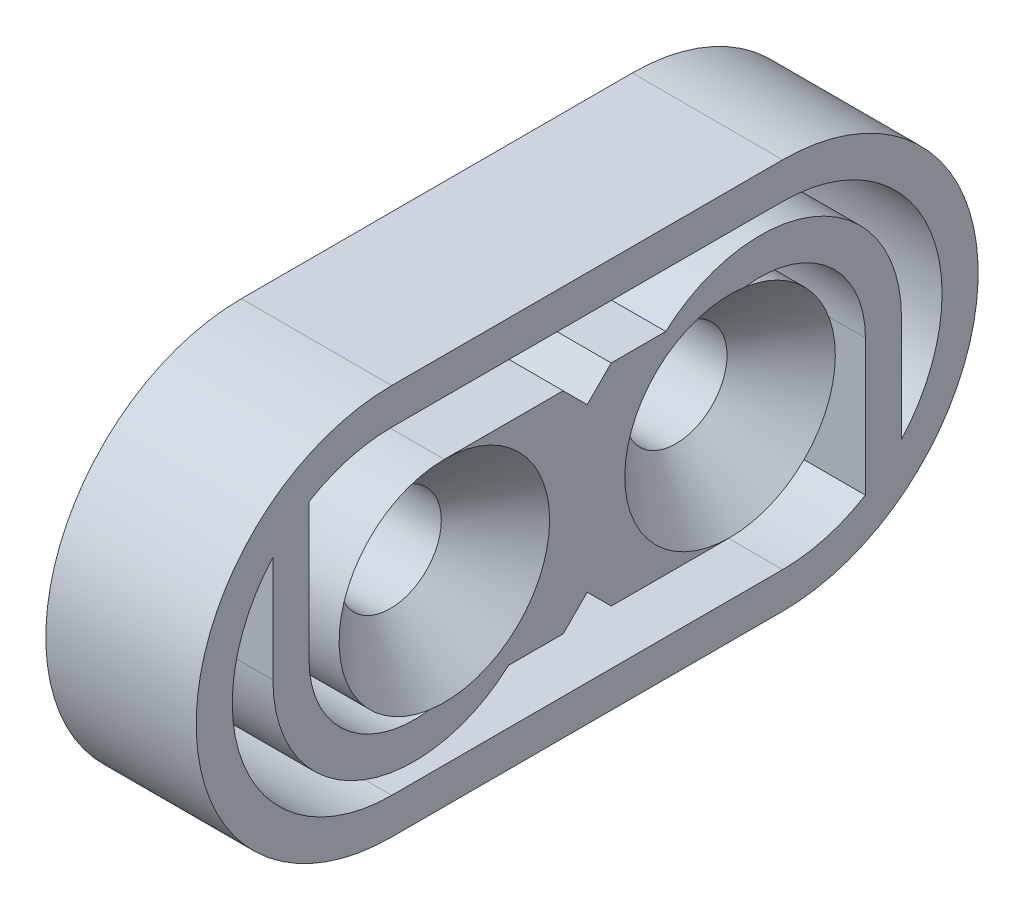
ISO-10303-21;
HEADER;
FILE_DESCRIPTION(('STEP AP214'),'2;1');
FILE_NAME('part.step','',(''),(''),'','','');
FILE_SCHEMA(('AUTOMOTIVE_DESIGN { 1 0 10303 214 1 1 1 1 }'));
ENDSEC;
DATA;
#1=APPLICATION_CONTEXT('core data for automotive mechanical design processes');
#2=APPLICATION_PROTOCOL_DEFINITION('international standard','automotive_design',2000,#1);
#3=PRODUCT_CONTEXT('',#1,'mechanical');
#4=PRODUCT('Part','Part','',(#3));
#5=PRODUCT_RELATED_PRODUCT_CATEGORY('part','',(#4));
#6=PRODUCT_DEFINITION_FORMATION('','',#4);
#7=PRODUCT_DEFINITION_CONTEXT('part definition',#1,'design');
#8=PRODUCT_DEFINITION('design','',#6,#7);
#9=PRODUCT_DEFINITION_SHAPE('','',#8);
#10=(LENGTH_UNIT() NAMED_UNIT(*) SI_UNIT(.MILLI.,.METRE.));
#11=(NAMED_UNIT(*) PLANE_ANGLE_UNIT() SI_UNIT($,.RADIAN.));
#12=(NAMED_UNIT(*) SI_UNIT($,.STERADIAN.) SOLID_ANGLE_UNIT());
#13=UNCERTAINTY_MEASURE_WITH_UNIT(LENGTH_MEASURE(1.E-05),#10,'distance_accuracy_value','');
#14=(GEOMETRIC_REPRESENTATION_CONTEXT(3) GLOBAL_UNCERTAINTY_ASSIGNED_CONTEXT((#13)) GLOBAL_UNIT_ASSIGNED_CONTEXT((#10,
#11,#12)) REPRESENTATION_CONTEXT('',''));
#15=CARTESIAN_POINT('',(0.,0.,0.));
#16=DIRECTION('',(0.,0.,1.));
#17=DIRECTION('',(1.,0.,0.));
#18=AXIS2_PLACEMENT_3D('',#15,#16,#17);
#19=CARTESIAN_POINT('',(5.,0.0278549064895704,6.49624326478912));
#20=DIRECTION('',(1.,0.,0.));
#21=DIRECTION('',(0.,0.,-1.));
#22=AXIS2_PLACEMENT_3D('',#19,#20,#21);
#23=PLANE('',#22);
#24=CARTESIAN_POINT('',(5.,0.0278549064895704,6.49624326478912));
#25=DIRECTION('',(1.,0.,0.));
#26=DIRECTION('',(0.,0.,-1.));
#27=AXIS2_PLACEMENT_3D('',#24,#25,#26);
#28=CIRCLE('',#27,6.5);
#29=CARTESIAN_POINT('',(5.,6.52785490648957,6.49624326478912));
#30=VERTEX_POINT('',#29);
#31=CARTESIAN_POINT('',(5.,-6.47214509351043,6.49624326478912));
#32=VERTEX_POINT('',#31);
#33=EDGE_CURVE('E415',#30,#32,#28,.T.);
#34=ORIENTED_EDGE('',*,*,#33,.T.);
#35=DIRECTION('',(0.,0.,-1.));
#36=VECTOR('',#35,1.);
#37=CARTESIAN_POINT('',(5.,-6.47214509351043,6.49624326478912));
#38=LINE('',#37,#36);
#39=CARTESIAN_POINT('',(5.,-6.47214509351043,-6.50375673521088));
#40=VERTEX_POINT('',#39);
#41=EDGE_CURVE('E414',#32,#40,#38,.T.);
#42=ORIENTED_EDGE('',*,*,#41,.T.);
#43=CARTESIAN_POINT('',(5.,0.0278549064895723,-6.50375673521088));
#44=DIRECTION('',(1.,0.,0.));
#45=DIRECTION('',(0.,0.,-1.));
#46=AXIS2_PLACEMENT_3D('',#43,#44,#45);
#47=CIRCLE('',#46,6.5);
#48=CARTESIAN_POINT('',(5.,6.52785490648957,-6.50375673521088));
#49=VERTEX_POINT('',#48);
#50=EDGE_CURVE('E416',#40,#49,#47,.T.);
#51=ORIENTED_EDGE('',*,*,#50,.T.);
#52=DIRECTION('',(0.,0.,1.));
#53=VECTOR('',#52,1.);
#54=CARTESIAN_POINT('',(5.,6.52785490648957,6.49624326478912));
#55=LINE('',#54,#53);
#56=EDGE_CURVE('E419',#49,#30,#55,.T.);
#57=ORIENTED_EDGE('',*,*,#56,.T.);
#58=EDGE_LOOP('',(#34,#42,#51,#57));
#59=FACE_BOUND('',#58,.T.);
#60=DIRECTION('',(0.,0.,1.));
#61=VECTOR('',#60,1.);
#62=CARTESIAN_POINT('',(5.,-3.47214509351043,-0.803756735210877));
#63=LINE('',#62,#61);
#64=CARTESIAN_POINT('',(5.,-3.47214509351043,-4.7537567352109));
#65=VERTEX_POINT('',#64);
#66=CARTESIAN_POINT('',(5.,-3.47214509351043,-0.803756735210877));
#67=VERTEX_POINT('',#66);
#68=EDGE_CURVE('E337',#65,#67,#63,.T.);
#69=ORIENTED_EDGE('',*,*,#68,.F.);
#70=CARTESIAN_POINT('',(5.,0.0278549064895708,-4.75375673521088));
#71=DIRECTION('',(1.,0.,0.));
#72=DIRECTION('',(0.,0.,-1.));
#73=AXIS2_PLACEMENT_3D('',#70,#71,#72);
#74=CIRCLE('',#73,3.5);
#75=CARTESIAN_POINT('',(5.,3.49195652162733,-5.25375673521088));
#76=VERTEX_POINT('',#75);
#77=EDGE_CURVE('E49',#65,#76,#74,.F.);
#78=ORIENTED_EDGE('',*,*,#77,.T.);
#79=CARTESIAN_POINT('',(5.,0.0278549064895708,-5.75375673521088));
#80=DIRECTION('',(1.,0.,0.));
#81=DIRECTION('',(0.,0.,-1.));
#82=AXIS2_PLACEMENT_3D('',#79,#80,#81);
#83=CIRCLE('',#82,3.5);
#84=CARTESIAN_POINT('',(5.,0.0278549064895708,-9.25375673521088));
#85=VERTEX_POINT('',#84);
#86=EDGE_CURVE('E334',#85,#76,#83,.T.);
#87=ORIENTED_EDGE('',*,*,#86,.F.);
#88=DIRECTION('',(0.,1.,0.));
#89=VECTOR('',#88,1.);
#90=CARTESIAN_POINT('',(5.,-4.50287351176726,-9.25375673521088));
#91=LINE('',#90,#89);
#92=CARTESIAN_POINT('',(5.,-4.50287351176726,-9.25375673521087));
#93=VERTEX_POINT('',#92);
#94=EDGE_CURVE('E332',#93,#85,#91,.T.);
#95=ORIENTED_EDGE('',*,*,#94,.F.);
#96=CARTESIAN_POINT('',(5.,0.0278549064895723,-6.50375673521088));
#97=DIRECTION('',(1.,0.,0.));
#98=DIRECTION('',(0.,0.,-1.));
#99=AXIS2_PLACEMENT_3D('',#96,#97,#98);
#100=CIRCLE('',#99,5.3);
#101=CARTESIAN_POINT('',(5.,-5.27214509351043,-6.50375673521091));
#102=VERTEX_POINT('',#101);
#103=EDGE_CURVE('E328',#102,#93,#100,.T.);
#104=ORIENTED_EDGE('',*,*,#103,.F.);
#105=DIRECTION('',(0.,0.,-1.));
#106=VECTOR('',#105,1.);
#107=CARTESIAN_POINT('',(5.,-5.27214509351043,6.49624326478912));
#108=LINE('',#107,#106);
#109=CARTESIAN_POINT('',(5.,-5.27214509351043,6.49624326478912));
#110=VERTEX_POINT('',#109);
#111=EDGE_CURVE('E326',#110,#102,#108,.T.);
#112=ORIENTED_EDGE('',*,*,#111,.F.);
#113=CARTESIAN_POINT('',(5.,0.02785490648957,6.49624326478912));
#114=DIRECTION('',(1.,0.,0.));
#115=DIRECTION('',(0.,0.,-1.));
#116=AXIS2_PLACEMENT_3D('',#113,#114,#115);
#117=CIRCLE('',#116,5.3);
#118=CARTESIAN_POINT('',(5.,3.5616206033065,10.4462432647891));
#119=VERTEX_POINT('',#118);
#120=EDGE_CURVE('E322',#119,#110,#117,.T.);
#121=ORIENTED_EDGE('',*,*,#120,.F.);
#122=DIRECTION('',(0.,1.,0.));
#123=VECTOR('',#122,1.);
#124=CARTESIAN_POINT('',(5.,0.0278549064895708,10.4462432647891));
#125=LINE('',#124,#123);
#126=CARTESIAN_POINT('',(5.,0.0278549064895714,10.4462432647891));
#127=VERTEX_POINT('',#126);
#128=EDGE_CURVE('E349',#127,#119,#125,.T.);
#129=ORIENTED_EDGE('',*,*,#128,.F.);
#130=CARTESIAN_POINT('',(5.,0.0278549064895708,5.74624326478912));
#131=DIRECTION('',(-1.,0.,0.));
#132=DIRECTION('',(0.,0.,-1.));
#133=AXIS2_PLACEMENT_3D('',#130,#131,#132);
#134=CIRCLE('',#133,4.7);
#135=CARTESIAN_POINT('',(5.,-3.47214509351043,2.6093658365175));
#136=VERTEX_POINT('',#135);
#137=EDGE_CURVE('E347',#136,#127,#134,.T.);
#138=ORIENTED_EDGE('',*,*,#137,.F.);
#139=DIRECTION('',(0.,0.,1.));
#140=VECTOR('',#139,1.);
#141=CARTESIAN_POINT('',(5.,-3.47214509351043,2.6093658365175));
#142=LINE('',#141,#140);
#143=CARTESIAN_POINT('',(5.,-3.47214509351043,0.796243264789123));
#144=VERTEX_POINT('',#143);
#145=EDGE_CURVE('E343',#144,#136,#142,.T.);
#146=ORIENTED_EDGE('',*,*,#145,.F.);
#147=DIRECTION('',(0.,-0.707106781186547,0.707106781186548));
#148=VECTOR('',#147,1.);
#149=CARTESIAN_POINT('',(5.,-3.47214509351043,0.796243264789123));
#150=LINE('',#149,#148);
#151=CARTESIAN_POINT('',(5.,-2.67214509351043,-0.00375673521087715));
#152=VERTEX_POINT('',#151);
#153=EDGE_CURVE('E345',#152,#144,#150,.T.);
#154=ORIENTED_EDGE('',*,*,#153,.F.);
#155=DIRECTION('',(0.,0.707106781186548,0.707106781186547));
#156=VECTOR('',#155,1.);
#157=CARTESIAN_POINT('',(5.,-2.67214509351043,-0.00375673521087715));
#158=LINE('',#157,#156);
#159=EDGE_CURVE('E339',#67,#152,#158,.T.);
#160=ORIENTED_EDGE('',*,*,#159,.F.);
#161=EDGE_LOOP('',(#69,#78,#87,#95,#104,#112,#121,#129,#138,#146,#154,#160));
#162=FACE_BOUND('',#161,.T.);
#163=DIRECTION('',(0.,0.,-1.));
#164=VECTOR('',#163,1.);
#165=CARTESIAN_POINT('',(5.,3.52785490648957,0.796243264789123));
#166=LINE('',#165,#164);
#167=CARTESIAN_POINT('',(5.,3.52785490648957,4.74624326478912));
#168=VERTEX_POINT('',#167);
#169=CARTESIAN_POINT('',(5.,3.52785490648957,0.796243264789123));
#170=VERTEX_POINT('',#169);
#171=EDGE_CURVE('E260',#168,#170,#166,.T.);
#172=ORIENTED_EDGE('',*,*,#171,.F.);
#173=CARTESIAN_POINT('',(5.,0.0278549064895708,4.74624326478912));
#174=DIRECTION('',(1.,0.,0.));
#175=DIRECTION('',(0.,0.,-1.));
#176=AXIS2_PLACEMENT_3D('',#173,#174,#175);
#177=CIRCLE('',#176,3.5);
#178=CARTESIAN_POINT('',(5.,-3.43624670864818,5.24624326478913));
#179=VERTEX_POINT('',#178);
#180=EDGE_CURVE('E441',#168,#179,#177,.F.);
#181=ORIENTED_EDGE('',*,*,#180,.T.);
#182=CARTESIAN_POINT('',(5.,0.0278549064895708,5.74624326478912));
#183=DIRECTION('',(1.,0.,0.));
#184=DIRECTION('',(0.,0.,-1.));
#185=AXIS2_PLACEMENT_3D('',#182,#183,#184);
#186=CIRCLE('',#185,3.5);
#187=CARTESIAN_POINT('',(5.,0.0278549064895586,9.24624326478912));
#188=VERTEX_POINT('',#187);
#189=EDGE_CURVE('E248',#188,#179,#186,.T.);
#190=ORIENTED_EDGE('',*,*,#189,.F.);
#191=DIRECTION('',(0.,-1.,0.));
#192=VECTOR('',#191,1.);
#193=CARTESIAN_POINT('',(5.,4.5585833247464,9.24624326478912));
#194=LINE('',#193,#192);
#195=CARTESIAN_POINT('',(5.,4.5585833247464,9.24624326478912));
#196=VERTEX_POINT('',#195);
#197=EDGE_CURVE('E234',#196,#188,#194,.T.);
#198=ORIENTED_EDGE('',*,*,#197,.F.);
#199=CARTESIAN_POINT('',(5.,0.02785490648957,6.49624326478912));
#200=DIRECTION('',(1.,0.,0.));
#201=DIRECTION('',(0.,0.,-1.));
#202=AXIS2_PLACEMENT_3D('',#199,#200,#201);
#203=CIRCLE('',#202,5.3);
#204=CARTESIAN_POINT('',(5.,5.32785490648957,6.49624326478912));
#205=VERTEX_POINT('',#204);
#206=EDGE_CURVE('E230',#205,#196,#203,.T.);
#207=ORIENTED_EDGE('',*,*,#206,.F.);
#208=DIRECTION('',(0.,0.,1.));
#209=VECTOR('',#208,1.);
#210=CARTESIAN_POINT('',(5.,5.32785490648957,6.49624326478912));
#211=LINE('',#210,#209);
#212=CARTESIAN_POINT('',(5.,5.32785490648957,-6.50375673521088));
#213=VERTEX_POINT('',#212);
#214=EDGE_CURVE('E271',#213,#205,#211,.T.);
#215=ORIENTED_EDGE('',*,*,#214,.F.);
#216=CARTESIAN_POINT('',(5.,0.0278549064895723,-6.50375673521088));
#217=DIRECTION('',(1.,0.,0.));
#218=DIRECTION('',(0.,0.,-1.));
#219=AXIS2_PLACEMENT_3D('',#216,#217,#218);
#220=CIRCLE('',#219,5.3);
#221=CARTESIAN_POINT('',(5.,-3.50591079032736,-10.4537567352109));
#222=VERTEX_POINT('',#221);
#223=EDGE_CURVE('E267',#222,#213,#220,.T.);
#224=ORIENTED_EDGE('',*,*,#223,.F.);
#225=DIRECTION('',(0.,-1.,0.));
#226=VECTOR('',#225,1.);
#227=CARTESIAN_POINT('',(5.,-3.50591079032736,-10.4537567352109));
#228=LINE('',#227,#226);
#229=CARTESIAN_POINT('',(5.,0.0278549064895708,-10.4537567352109));
#230=VERTEX_POINT('',#229);
#231=EDGE_CURVE('E270',#230,#222,#228,.T.);
#232=ORIENTED_EDGE('',*,*,#231,.F.);
#233=CARTESIAN_POINT('',(5.,0.0278549064895708,-5.75375673521088));
#234=DIRECTION('',(-1.,0.,0.));
#235=DIRECTION('',(0.,0.,-1.));
#236=AXIS2_PLACEMENT_3D('',#233,#234,#235);
#237=CIRCLE('',#236,4.7);
#238=CARTESIAN_POINT('',(5.,3.52785490648957,-2.61687930693925));
#239=VERTEX_POINT('',#238);
#240=EDGE_CURVE('E264',#239,#230,#237,.T.);
#241=ORIENTED_EDGE('',*,*,#240,.F.);
#242=DIRECTION('',(0.,0.,-1.));
#243=VECTOR('',#242,1.);
#244=CARTESIAN_POINT('',(5.,3.52785490648957,-2.61687930693925));
#245=LINE('',#244,#243);
#246=CARTESIAN_POINT('',(5.,3.52785490648957,-0.803756735210877));
#247=VERTEX_POINT('',#246);
#248=EDGE_CURVE('E263',#247,#239,#245,.T.);
#249=ORIENTED_EDGE('',*,*,#248,.F.);
#250=DIRECTION('',(0.,0.707106781186548,-0.707106781186547));
#251=VECTOR('',#250,1.);
#252=CARTESIAN_POINT('',(5.,3.52785490648957,-0.803756735210877));
#253=LINE('',#252,#251);
#254=CARTESIAN_POINT('',(5.,2.72785490648957,-0.00375673521087715));
#255=VERTEX_POINT('',#254);
#256=EDGE_CURVE('E261',#255,#247,#253,.T.);
#257=ORIENTED_EDGE('',*,*,#256,.F.);
#258=DIRECTION('',(0.,-0.707106781186547,-0.707106781186548));
#259=VECTOR('',#258,1.);
#260=CARTESIAN_POINT('',(5.,2.72785490648957,-0.00375673521087715));
#261=LINE('',#260,#259);
#262=EDGE_CURVE('E259',#170,#255,#261,.T.);
#263=ORIENTED_EDGE('',*,*,#262,.F.);
#264=EDGE_LOOP('',(#172,#181,#190,#198,#207,#215,#224,#232,#241,#249,#257,#263));
#265=FACE_BOUND('',#264,.T.);
#266=ADVANCED_FACE('F41',(#59,#162,#265),#23,.T.);
#267=CARTESIAN_POINT('',(0.,0.0278549064895704,6.49624326478912));
#268=DIRECTION('',(1.,0.,0.));
#269=DIRECTION('',(0.,0.,-1.));
#270=AXIS2_PLACEMENT_3D('',#267,#268,#269);
#271=PLANE('',#270);
#272=CARTESIAN_POINT('',(0.,0.02785490648957,6.49624326478912));
#273=DIRECTION('',(1.,0.,0.));
#274=DIRECTION('',(0.,0.,-1.));
#275=AXIS2_PLACEMENT_3D('',#272,#273,#274);
#276=CIRCLE('',#275,5.3);
#277=CARTESIAN_POINT('',(0.,3.5616206033065,10.4462432647891));
#278=VERTEX_POINT('',#277);
#279=CARTESIAN_POINT('',(0.,-5.27214509351043,6.49624326478912));
#280=VERTEX_POINT('',#279);
#281=EDGE_CURVE('E242',#278,#280,#276,.T.);
#282=ORIENTED_EDGE('',*,*,#281,.T.);
#283=DIRECTION('',(0.,0.,-1.));
#284=VECTOR('',#283,1.);
#285=CARTESIAN_POINT('',(0.,-5.27214509351043,6.49624326478912));
#286=LINE('',#285,#284);
#287=CARTESIAN_POINT('',(0.,-5.27214509351043,-6.50375673521091));
#288=VERTEX_POINT('',#287);
#289=EDGE_CURVE('E353',#280,#288,#286,.T.);
#290=ORIENTED_EDGE('',*,*,#289,.T.);
#291=CARTESIAN_POINT('',(0.,0.0278549064895723,-6.50375673521088));
#292=DIRECTION('',(1.,0.,0.));
#293=DIRECTION('',(0.,0.,-1.));
#294=AXIS2_PLACEMENT_3D('',#291,#292,#293);
#295=CIRCLE('',#294,5.3);
#296=CARTESIAN_POINT('',(0.,-4.50287351176726,-9.25375673521087));
#297=VERTEX_POINT('',#296);
#298=EDGE_CURVE('E360',#288,#297,#295,.T.);
#299=ORIENTED_EDGE('',*,*,#298,.T.);
#300=DIRECTION('',(0.,1.,0.));
#301=VECTOR('',#300,1.);
#302=CARTESIAN_POINT('',(0.,-4.50287351176726,-9.25375673521088));
#303=LINE('',#302,#301);
#304=CARTESIAN_POINT('',(0.,0.0278549064895708,-9.25375673521088));
#305=VERTEX_POINT('',#304);
#306=EDGE_CURVE('E359',#297,#305,#303,.T.);
#307=ORIENTED_EDGE('',*,*,#306,.T.);
#308=CARTESIAN_POINT('',(0.,0.0278549064895708,-5.75375673521088));
#309=DIRECTION('',(1.,0.,0.));
#310=DIRECTION('',(0.,0.,-1.));
#311=AXIS2_PLACEMENT_3D('',#308,#309,#310);
#312=CIRCLE('',#311,3.5);
#313=CARTESIAN_POINT('',(0.,3.49195652162733,-5.25375673521088));
#314=VERTEX_POINT('',#313);
#315=EDGE_CURVE('E361',#305,#314,#312,.T.);
#316=ORIENTED_EDGE('',*,*,#315,.T.);
#317=CARTESIAN_POINT('',(0.,0.0278549064895708,-4.75375673521088));
#318=DIRECTION('',(-1.,0.,0.));
#319=DIRECTION('',(0.,0.,-1.));
#320=AXIS2_PLACEMENT_3D('',#317,#318,#319);
#321=CIRCLE('',#320,3.5);
#322=CARTESIAN_POINT('',(0.,-3.47214509351043,-4.7537567352109));
#323=VERTEX_POINT('',#322);
#324=EDGE_CURVE('E368',#314,#323,#321,.T.);
#325=ORIENTED_EDGE('',*,*,#324,.T.);
#326=DIRECTION('',(0.,0.,1.));
#327=VECTOR('',#326,1.);
#328=CARTESIAN_POINT('',(0.,-3.47214509351043,-0.803756735210877));
#329=LINE('',#328,#327);
#330=CARTESIAN_POINT('',(0.,-3.47214509351043,-0.803756735210877));
#331=VERTEX_POINT('',#330);
#332=EDGE_CURVE('E369',#323,#331,#329,.T.);
#333=ORIENTED_EDGE('',*,*,#332,.T.);
#334=DIRECTION('',(0.,0.707106781186548,0.707106781186547));
#335=VECTOR('',#334,1.);
#336=CARTESIAN_POINT('',(0.,-2.67214509351043,-0.00375673521087715));
#337=LINE('',#336,#335);
#338=CARTESIAN_POINT('',(0.,-2.67214509351043,-0.00375673521087715));
#339=VERTEX_POINT('',#338);
#340=EDGE_CURVE('E375',#331,#339,#337,.T.);
#341=ORIENTED_EDGE('',*,*,#340,.T.);
#342=DIRECTION('',(0.,-0.707106781186547,0.707106781186548));
#343=VECTOR('',#342,1.);
#344=CARTESIAN_POINT('',(0.,-3.47214509351043,0.796243264789123));
#345=LINE('',#344,#343);
#346=CARTESIAN_POINT('',(0.,-3.47214509351043,0.796243264789123));
#347=VERTEX_POINT('',#346);
#348=EDGE_CURVE('E374',#339,#347,#345,.T.);
#349=ORIENTED_EDGE('',*,*,#348,.T.);
#350=DIRECTION('',(0.,0.,1.));
#351=VECTOR('',#350,1.);
#352=CARTESIAN_POINT('',(0.,-3.47214509351043,2.6093658365175));
#353=LINE('',#352,#351);
#354=CARTESIAN_POINT('',(0.,-3.47214509351043,2.6093658365175));
#355=VERTEX_POINT('',#354);
#356=EDGE_CURVE('E378',#347,#355,#353,.T.);
#357=ORIENTED_EDGE('',*,*,#356,.T.);
#358=CARTESIAN_POINT('',(0.,0.0278549064895708,5.74624326478912));
#359=DIRECTION('',(-1.,0.,0.));
#360=DIRECTION('',(0.,0.,-1.));
#361=AXIS2_PLACEMENT_3D('',#358,#359,#360);
#362=CIRCLE('',#361,4.7);
#363=CARTESIAN_POINT('',(0.,0.0278549064895714,10.4462432647891));
#364=VERTEX_POINT('',#363);
#365=EDGE_CURVE('E381',#355,#364,#362,.T.);
#366=ORIENTED_EDGE('',*,*,#365,.T.);
#367=DIRECTION('',(0.,1.,0.));
#368=VECTOR('',#367,1.);
#369=CARTESIAN_POINT('',(0.,0.0278549064895708,10.4462432647891));
#370=LINE('',#369,#368);
#371=EDGE_CURVE('E330',#364,#278,#370,.T.);
#372=ORIENTED_EDGE('',*,*,#371,.T.);
#373=EDGE_LOOP('',(#282,#290,#299,#307,#316,#325,#333,#341,#349,#357,#366,#372));
#374=FACE_BOUND('',#373,.T.);
#375=CARTESIAN_POINT('',(0.,0.0278549064895704,6.49624326478912));
#376=DIRECTION('',(1.,0.,0.));
#377=DIRECTION('',(0.,0.,-1.));
#378=AXIS2_PLACEMENT_3D('',#375,#376,#377);
#379=CIRCLE('',#378,6.5);
#380=CARTESIAN_POINT('',(0.,6.52785490648957,6.49624326478912));
#381=VERTEX_POINT('',#380);
#382=CARTESIAN_POINT('',(0.,-6.47214509351043,6.49624326478912));
#383=VERTEX_POINT('',#382);
#384=EDGE_CURVE('E411',#381,#383,#379,.T.);
#385=ORIENTED_EDGE('',*,*,#384,.F.);
#386=DIRECTION('',(0.,0.,1.));
#387=VECTOR('',#386,1.);
#388=CARTESIAN_POINT('',(0.,6.52785490648957,6.49624326478912));
#389=LINE('',#388,#387);
#390=CARTESIAN_POINT('',(0.,6.52785490648957,-6.50375673521088));
#391=VERTEX_POINT('',#390);
#392=EDGE_CURVE('E418',#391,#381,#389,.T.);
#393=ORIENTED_EDGE('',*,*,#392,.F.);
#394=CARTESIAN_POINT('',(0.,0.0278549064895723,-6.50375673521088));
#395=DIRECTION('',(1.,0.,0.));
#396=DIRECTION('',(0.,0.,-1.));
#397=AXIS2_PLACEMENT_3D('',#394,#395,#396);
#398=CIRCLE('',#397,6.5);
#399=CARTESIAN_POINT('',(0.,-6.47214509351043,-6.50375673521088));
#400=VERTEX_POINT('',#399);
#401=EDGE_CURVE('E430',#400,#391,#398,.T.);
#402=ORIENTED_EDGE('',*,*,#401,.F.);
#403=DIRECTION('',(0.,0.,-1.));
#404=VECTOR('',#403,1.);
#405=CARTESIAN_POINT('',(0.,-6.47214509351043,6.49624326478912));
#406=LINE('',#405,#404);
#407=EDGE_CURVE('E422',#383,#400,#406,.T.);
#408=ORIENTED_EDGE('',*,*,#407,.F.);
#409=EDGE_LOOP('',(#385,#393,#402,#408));
#410=FACE_BOUND('',#409,.T.);
#411=CARTESIAN_POINT('',(0.,0.02785490648957,6.49624326478912));
#412=DIRECTION('',(1.,0.,0.));
#413=DIRECTION('',(0.,0.,-1.));
#414=AXIS2_PLACEMENT_3D('',#411,#412,#413);
#415=CIRCLE('',#414,5.3);
#416=CARTESIAN_POINT('',(0.,5.32785490648957,6.49624326478912));
#417=VERTEX_POINT('',#416);
#418=CARTESIAN_POINT('',(0.,4.5585833247464,9.24624326478912));
#419=VERTEX_POINT('',#418);
#420=EDGE_CURVE('E64',#417,#419,#415,.T.);
#421=ORIENTED_EDGE('',*,*,#420,.T.);
#422=DIRECTION('',(0.,-1.,0.));
#423=VECTOR('',#422,1.);
#424=CARTESIAN_POINT('',(0.,4.5585833247464,9.24624326478912));
#425=LINE('',#424,#423);
#426=CARTESIAN_POINT('',(0.,0.0278549064895586,9.24624326478912));
#427=VERTEX_POINT('',#426);
#428=EDGE_CURVE('E245',#419,#427,#425,.T.);
#429=ORIENTED_EDGE('',*,*,#428,.T.);
#430=CARTESIAN_POINT('',(0.,0.0278549064895708,5.74624326478912));
#431=DIRECTION('',(1.,0.,0.));
#432=DIRECTION('',(0.,0.,-1.));
#433=AXIS2_PLACEMENT_3D('',#430,#431,#432);
#434=CIRCLE('',#433,3.5);
#435=CARTESIAN_POINT('',(0.,-3.43624670864818,5.24624326478913));
#436=VERTEX_POINT('',#435);
#437=EDGE_CURVE('E277',#427,#436,#434,.T.);
#438=ORIENTED_EDGE('',*,*,#437,.T.);
#439=CARTESIAN_POINT('',(0.,0.0278549064895708,4.74624326478912));
#440=DIRECTION('',(-1.,0.,0.));
#441=DIRECTION('',(0.,0.,-1.));
#442=AXIS2_PLACEMENT_3D('',#439,#440,#441);
#443=CIRCLE('',#442,3.5);
#444=CARTESIAN_POINT('',(0.,3.52785490648957,4.74624326478912));
#445=VERTEX_POINT('',#444);
#446=EDGE_CURVE('E276',#436,#445,#443,.T.);
#447=ORIENTED_EDGE('',*,*,#446,.T.);
#448=DIRECTION('',(0.,0.,-1.));
#449=VECTOR('',#448,1.);
#450=CARTESIAN_POINT('',(0.,3.52785490648957,0.796243264789123));
#451=LINE('',#450,#449);
#452=CARTESIAN_POINT('',(0.,3.52785490648957,0.796243264789123));
#453=VERTEX_POINT('',#452);
#454=EDGE_CURVE('E285',#445,#453,#451,.T.);
#455=ORIENTED_EDGE('',*,*,#454,.T.);
#456=DIRECTION('',(0.,-0.707106781186547,-0.707106781186548));
#457=VECTOR('',#456,1.);
#458=CARTESIAN_POINT('',(0.,2.72785490648957,-0.00375673521087715));
#459=LINE('',#458,#457);
#460=CARTESIAN_POINT('',(0.,2.72785490648957,-0.00375673521087715));
#461=VERTEX_POINT('',#460);
#462=EDGE_CURVE('E284',#453,#461,#459,.T.);
#463=ORIENTED_EDGE('',*,*,#462,.T.);
#464=DIRECTION('',(0.,0.707106781186548,-0.707106781186547));
#465=VECTOR('',#464,1.);
#466=CARTESIAN_POINT('',(0.,3.52785490648957,-0.803756735210877));
#467=LINE('',#466,#465);
#468=CARTESIAN_POINT('',(0.,3.52785490648957,-0.803756735210877));
#469=VERTEX_POINT('',#468);
#470=EDGE_CURVE('E287',#461,#469,#467,.T.);
#471=ORIENTED_EDGE('',*,*,#470,.T.);
#472=DIRECTION('',(0.,0.,-1.));
#473=VECTOR('',#472,1.);
#474=CARTESIAN_POINT('',(0.,3.52785490648957,-2.61687930693925));
#475=LINE('',#474,#473);
#476=CARTESIAN_POINT('',(0.,3.52785490648957,-2.61687930693925));
#477=VERTEX_POINT('',#476);
#478=EDGE_CURVE('E292',#469,#477,#475,.T.);
#479=ORIENTED_EDGE('',*,*,#478,.T.);
#480=CARTESIAN_POINT('',(0.,0.0278549064895708,-5.75375673521088));
#481=DIRECTION('',(-1.,0.,0.));
#482=DIRECTION('',(0.,0.,-1.));
#483=AXIS2_PLACEMENT_3D('',#480,#481,#482);
#484=CIRCLE('',#483,4.7);
#485=CARTESIAN_POINT('',(0.,0.0278549064895708,-10.4537567352109));
#486=VERTEX_POINT('',#485);
#487=EDGE_CURVE('E294',#477,#486,#484,.T.);
#488=ORIENTED_EDGE('',*,*,#487,.T.);
#489=DIRECTION('',(0.,-1.,0.));
#490=VECTOR('',#489,1.);
#491=CARTESIAN_POINT('',(0.,-3.50591079032736,-10.4537567352109));
#492=LINE('',#491,#490);
#493=CARTESIAN_POINT('',(0.,-3.50591079032736,-10.4537567352109));
#494=VERTEX_POINT('',#493);
#495=EDGE_CURVE('E300',#486,#494,#492,.T.);
#496=ORIENTED_EDGE('',*,*,#495,.T.);
#497=CARTESIAN_POINT('',(0.,0.0278549064895723,-6.50375673521088));
#498=DIRECTION('',(1.,0.,0.));
#499=DIRECTION('',(0.,0.,-1.));
#500=AXIS2_PLACEMENT_3D('',#497,#498,#499);
#501=CIRCLE('',#500,5.3);
#502=CARTESIAN_POINT('',(0.,5.32785490648958,-6.50375673521088));
#503=VERTEX_POINT('',#502);
#504=EDGE_CURVE('E299',#494,#503,#501,.T.);
#505=ORIENTED_EDGE('',*,*,#504,.T.);
#506=DIRECTION('',(0.,0.,1.));
#507=VECTOR('',#506,1.);
#508=CARTESIAN_POINT('',(0.,5.32785490648957,6.49624326478912));
#509=LINE('',#508,#507);
#510=EDGE_CURVE('E237',#503,#417,#509,.T.);
#511=ORIENTED_EDGE('',*,*,#510,.T.);
#512=EDGE_LOOP('',(#421,#429,#438,#447,#455,#463,#471,#479,#488,#496,#505,#511));
#513=FACE_BOUND('',#512,.T.);
#514=CARTESIAN_POINT('',(0.,0.0278549064895708,4.74624326478912));
#515=DIRECTION('',(1.,0.,0.));
#516=DIRECTION('',(0.,0.,-1.));
#517=AXIS2_PLACEMENT_3D('',#514,#515,#516);
#518=CIRCLE('',#517,1.7);
#519=CARTESIAN_POINT('',(0.,0.0278549064895708,3.04624326478912));
#520=VERTEX_POINT('',#519);
#521=EDGE_CURVE('E273',#520,#520,#518,.T.);
#522=ORIENTED_EDGE('',*,*,#521,.T.);
#523=EDGE_LOOP('',(#522));
#524=FACE_BOUND('',#523,.T.);
#525=CARTESIAN_POINT('',(0.,0.0278549064895708,-4.75375673521088));
#526=DIRECTION('',(1.,0.,0.));
#527=DIRECTION('',(0.,0.,-1.));
#528=AXIS2_PLACEMENT_3D('',#525,#526,#527);
#529=CIRCLE('',#528,1.7);
#530=CARTESIAN_POINT('',(0.,0.0278549064895708,-6.45375673521088));
#531=VERTEX_POINT('',#530);
#532=EDGE_CURVE('E562',#531,#531,#529,.T.);
#533=ORIENTED_EDGE('',*,*,#532,.T.);
#534=EDGE_LOOP('',(#533));
#535=FACE_BOUND('',#534,.T.);
#536=ADVANCED_FACE('F463',(#374,#410,#513,#524,#535),#271,.F.);
#537=CARTESIAN_POINT('',(5.,0.0278549064895704,6.49624326478912));
#538=DIRECTION('',(-1.,0.,0.));
#539=DIRECTION('',(0.,0.,1.));
#540=AXIS2_PLACEMENT_3D('',#537,#538,#539);
#541=CYLINDRICAL_SURFACE('',#540,6.5);
#542=ORIENTED_EDGE('',*,*,#384,.T.);
#543=DIRECTION('',(-1.,0.,0.));
#544=VECTOR('',#543,1.);
#545=CARTESIAN_POINT('',(5.,-6.47214509351043,6.49624326478912));
#546=LINE('',#545,#544);
#547=EDGE_CURVE('E437',#32,#383,#546,.T.);
#548=ORIENTED_EDGE('',*,*,#547,.F.);
#549=ORIENTED_EDGE('',*,*,#33,.F.);
#550=DIRECTION('',(-1.,0.,0.));
#551=VECTOR('',#550,1.);
#552=CARTESIAN_POINT('',(5.,6.52785490648957,6.49624326478912));
#553=LINE('',#552,#551);
#554=EDGE_CURVE('E425',#30,#381,#553,.T.);
#555=ORIENTED_EDGE('',*,*,#554,.T.);
#556=EDGE_LOOP('',(#542,#548,#549,#555));
#557=FACE_BOUND('',#556,.T.);
#558=ADVANCED_FACE('F524',(#557),#541,.T.);
#559=CARTESIAN_POINT('',(5.,-6.47214509351043,6.49624326478912));
#560=DIRECTION('',(0.,1.,0.));
#561=DIRECTION('',(0.,0.,1.));
#562=AXIS2_PLACEMENT_3D('',#559,#560,#561);
#563=PLANE('',#562);
#564=ORIENTED_EDGE('',*,*,#407,.T.);
#565=DIRECTION('',(-1.,0.,0.));
#566=VECTOR('',#565,1.);
#567=CARTESIAN_POINT('',(5.,-6.47214509351043,-6.50375673521088));
#568=LINE('',#567,#566);
#569=EDGE_CURVE('E434',#40,#400,#568,.T.);
#570=ORIENTED_EDGE('',*,*,#569,.F.);
#571=ORIENTED_EDGE('',*,*,#41,.F.);
#572=ORIENTED_EDGE('',*,*,#547,.T.);
#573=EDGE_LOOP('',(#564,#570,#571,#572));
#574=FACE_BOUND('',#573,.T.);
#575=ADVANCED_FACE('F540',(#574),#563,.F.);
#576=CARTESIAN_POINT('',(5.,0.0278549064895723,-6.50375673521088));
#577=DIRECTION('',(-1.,0.,0.));
#578=DIRECTION('',(0.,0.,1.));
#579=AXIS2_PLACEMENT_3D('',#576,#577,#578);
#580=CYLINDRICAL_SURFACE('',#579,6.5);
#581=ORIENTED_EDGE('',*,*,#401,.T.);
#582=DIRECTION('',(-1.,0.,0.));
#583=VECTOR('',#582,1.);
#584=CARTESIAN_POINT('',(5.,6.52785490648957,-6.50375673521088));
#585=LINE('',#584,#583);
#586=EDGE_CURVE('E435',#49,#391,#585,.T.);
#587=ORIENTED_EDGE('',*,*,#586,.F.);
#588=ORIENTED_EDGE('',*,*,#50,.F.);
#589=ORIENTED_EDGE('',*,*,#569,.T.);
#590=EDGE_LOOP('',(#581,#587,#588,#589));
#591=FACE_BOUND('',#590,.T.);
#592=ADVANCED_FACE('F531',(#591),#580,.T.);
#593=CARTESIAN_POINT('',(5.,6.52785490648957,6.49624326478912));
#594=DIRECTION('',(0.,-1.,0.));
#595=DIRECTION('',(0.,0.,-1.));
#596=AXIS2_PLACEMENT_3D('',#593,#594,#595);
#597=PLANE('',#596);
#598=ORIENTED_EDGE('',*,*,#392,.T.);
#599=ORIENTED_EDGE('',*,*,#554,.F.);
#600=ORIENTED_EDGE('',*,*,#56,.F.);
#601=ORIENTED_EDGE('',*,*,#586,.T.);
#602=EDGE_LOOP('',(#598,#599,#600,#601));
#603=FACE_BOUND('',#602,.T.);
#604=ADVANCED_FACE('F529',(#603),#597,.F.);
#605=CARTESIAN_POINT('',(5.,0.02785490648957,6.49624326478912));
#606=DIRECTION('',(-1.,0.,0.));
#607=DIRECTION('',(0.,0.,1.));
#608=AXIS2_PLACEMENT_3D('',#605,#606,#607);
#609=CYLINDRICAL_SURFACE('',#608,5.3);
#610=ORIENTED_EDGE('',*,*,#281,.F.);
#611=DIRECTION('',(-1.,0.,0.));
#612=VECTOR('',#611,1.);
#613=CARTESIAN_POINT('',(5.,3.5616206033065,10.4462432647891));
#614=LINE('',#613,#612);
#615=EDGE_CURVE('E351',#119,#278,#614,.T.);
#616=ORIENTED_EDGE('',*,*,#615,.F.);
#617=ORIENTED_EDGE('',*,*,#120,.T.);
#618=DIRECTION('',(-1.,0.,0.));
#619=VECTOR('',#618,1.);
#620=CARTESIAN_POINT('',(5.,-5.27214509351043,6.49624326478912));
#621=LINE('',#620,#619);
#622=EDGE_CURVE('E407',#110,#280,#621,.T.);
#623=ORIENTED_EDGE('',*,*,#622,.T.);
#624=EDGE_LOOP('',(#610,#616,#617,#623));
#625=FACE_BOUND('',#624,.T.);
#626=ADVANCED_FACE('F481',(#625),#609,.F.);
#627=CARTESIAN_POINT('',(5.,-5.27214509351043,6.49624326478912));
#628=DIRECTION('',(0.,1.,0.));
#629=DIRECTION('',(0.,0.,1.));
#630=AXIS2_PLACEMENT_3D('',#627,#628,#629);
#631=PLANE('',#630);
#632=ORIENTED_EDGE('',*,*,#289,.F.);
#633=ORIENTED_EDGE('',*,*,#622,.F.);
#634=ORIENTED_EDGE('',*,*,#111,.T.);
#635=DIRECTION('',(-1.,0.,0.));
#636=VECTOR('',#635,1.);
#637=CARTESIAN_POINT('',(5.,-5.27214509351043,-6.50375673521091));
#638=LINE('',#637,#636);
#639=EDGE_CURVE('E406',#102,#288,#638,.T.);
#640=ORIENTED_EDGE('',*,*,#639,.T.);
#641=EDGE_LOOP('',(#632,#633,#634,#640));
#642=FACE_BOUND('',#641,.T.);
#643=ADVANCED_FACE('F476',(#642),#631,.T.);
#644=CARTESIAN_POINT('',(5.,0.0278549064895723,-6.50375673521088));
#645=DIRECTION('',(-1.,0.,0.));
#646=DIRECTION('',(0.,0.,1.));
#647=AXIS2_PLACEMENT_3D('',#644,#645,#646);
#648=CYLINDRICAL_SURFACE('',#647,5.3);
#649=ORIENTED_EDGE('',*,*,#298,.F.);
#650=ORIENTED_EDGE('',*,*,#639,.F.);
#651=ORIENTED_EDGE('',*,*,#103,.T.);
#652=DIRECTION('',(-1.,0.,0.));
#653=VECTOR('',#652,1.);
#654=CARTESIAN_POINT('',(5.,-4.50287351176726,-9.25375673521087));
#655=LINE('',#654,#653);
#656=EDGE_CURVE('E404',#93,#297,#655,.T.);
#657=ORIENTED_EDGE('',*,*,#656,.T.);
#658=EDGE_LOOP('',(#649,#650,#651,#657));
#659=FACE_BOUND('',#658,.T.);
#660=ADVANCED_FACE('F478',(#659),#648,.F.);
#661=CARTESIAN_POINT('',(5.,-4.50287351176726,-9.25375673521088));
#662=DIRECTION('',(0.,0.,1.));
#663=DIRECTION('',(1.,0.,0.));
#664=AXIS2_PLACEMENT_3D('',#661,#662,#663);
#665=PLANE('',#664);
#666=ORIENTED_EDGE('',*,*,#306,.F.);
#667=ORIENTED_EDGE('',*,*,#656,.F.);
#668=ORIENTED_EDGE('',*,*,#94,.T.);
#669=DIRECTION('',(-1.,0.,0.));
#670=VECTOR('',#669,1.);
#671=CARTESIAN_POINT('',(5.,0.0278549064895708,-9.25375673521088));
#672=LINE('',#671,#670);
#673=EDGE_CURVE('E405',#85,#305,#672,.T.);
#674=ORIENTED_EDGE('',*,*,#673,.T.);
#675=EDGE_LOOP('',(#666,#667,#668,#674));
#676=FACE_BOUND('',#675,.T.);
#677=ADVANCED_FACE('F469',(#676),#665,.T.);
#678=CARTESIAN_POINT('',(5.,0.0278549064895708,-5.75375673521088));
#679=DIRECTION('',(-1.,0.,0.));
#680=DIRECTION('',(0.,0.,1.));
#681=AXIS2_PLACEMENT_3D('',#678,#679,#680);
#682=CYLINDRICAL_SURFACE('',#681,3.5);
#683=ORIENTED_EDGE('',*,*,#315,.F.);
#684=ORIENTED_EDGE('',*,*,#673,.F.);
#685=ORIENTED_EDGE('',*,*,#86,.T.);
#686=DIRECTION('',(-1.,0.,0.));
#687=VECTOR('',#686,1.);
#688=CARTESIAN_POINT('',(5.,3.49195652162733,-5.25375673521088));
#689=LINE('',#688,#687);
#690=EDGE_CURVE('E399',#76,#314,#689,.T.);
#691=ORIENTED_EDGE('',*,*,#690,.T.);
#692=EDGE_LOOP('',(#683,#684,#685,#691));
#693=FACE_BOUND('',#692,.T.);
#694=ADVANCED_FACE('F460',(#693),#682,.F.);
#695=CARTESIAN_POINT('',(5.,0.0278549064895708,-4.75375673521088));
#696=DIRECTION('',(-1.,0.,0.));
#697=DIRECTION('',(0.,0.,1.));
#698=AXIS2_PLACEMENT_3D('',#695,#696,#697);
#699=CYLINDRICAL_SURFACE('',#698,3.5);
#700=ORIENTED_EDGE('',*,*,#324,.F.);
#701=ORIENTED_EDGE('',*,*,#690,.F.);
#702=CARTESIAN_POINT('',(5.,0.0278549064895708,-4.75375673521088));
#703=DIRECTION('',(-1.,0.,0.));
#704=DIRECTION('',(0.,0.,-1.));
#705=AXIS2_PLACEMENT_3D('',#702,#703,#704);
#706=CIRCLE('',#705,3.5);
#707=EDGE_CURVE('E336',#76,#65,#706,.T.);
#708=ORIENTED_EDGE('',*,*,#707,.T.);
#709=DIRECTION('',(-1.,0.,0.));
#710=VECTOR('',#709,1.);
#711=CARTESIAN_POINT('',(5.,-3.47214509351043,-4.7537567352109));
#712=LINE('',#711,#710);
#713=EDGE_CURVE('E397',#65,#323,#712,.T.);
#714=ORIENTED_EDGE('',*,*,#713,.T.);
#715=EDGE_LOOP('',(#700,#701,#708,#714));
#716=FACE_BOUND('',#715,.T.);
#717=ADVANCED_FACE('F458',(#716),#699,.T.);
#718=CARTESIAN_POINT('',(5.,-3.47214509351043,-0.803756735210877));
#719=DIRECTION('',(0.,-1.,0.));
#720=DIRECTION('',(0.,0.,-1.));
#721=AXIS2_PLACEMENT_3D('',#718,#719,#720);
#722=PLANE('',#721);
#723=ORIENTED_EDGE('',*,*,#332,.F.);
#724=ORIENTED_EDGE('',*,*,#713,.F.);
#725=ORIENTED_EDGE('',*,*,#68,.T.);
#726=DIRECTION('',(-1.,0.,0.));
#727=VECTOR('',#726,1.);
#728=CARTESIAN_POINT('',(5.,-3.47214509351043,-0.803756735210877));
#729=LINE('',#728,#727);
#730=EDGE_CURVE('E396',#67,#331,#729,.T.);
#731=ORIENTED_EDGE('',*,*,#730,.T.);
#732=EDGE_LOOP('',(#723,#724,#725,#731));
#733=FACE_BOUND('',#732,.T.);
#734=ADVANCED_FACE('F510',(#733),#722,.T.);
#735=CARTESIAN_POINT('',(5.,-2.67214509351043,-0.00375673521087715));
#736=DIRECTION('',(0.,-0.707106781186547,0.707106781186548));
#737=DIRECTION('',(0.,-0.707106781186548,-0.707106781186547));
#738=AXIS2_PLACEMENT_3D('',#735,#736,#737);
#739=PLANE('',#738);
#740=ORIENTED_EDGE('',*,*,#340,.F.);
#741=ORIENTED_EDGE('',*,*,#730,.F.);
#742=ORIENTED_EDGE('',*,*,#159,.T.);
#743=DIRECTION('',(-1.,0.,0.));
#744=VECTOR('',#743,1.);
#745=CARTESIAN_POINT('',(5.,-2.67214509351043,-0.00375673521087715));
#746=LINE('',#745,#744);
#747=EDGE_CURVE('E393',#152,#339,#746,.T.);
#748=ORIENTED_EDGE('',*,*,#747,.T.);
#749=EDGE_LOOP('',(#740,#741,#742,#748));
#750=FACE_BOUND('',#749,.T.);
#751=ADVANCED_FACE('F504',(#750),#739,.T.);
#752=CARTESIAN_POINT('',(5.,-3.47214509351043,0.796243264789123));
#753=DIRECTION('',(0.,-0.707106781186548,-0.707106781186547));
#754=DIRECTION('',(0.,0.707106781186547,-0.707106781186548));
#755=AXIS2_PLACEMENT_3D('',#752,#753,#754);
#756=PLANE('',#755);
#757=ORIENTED_EDGE('',*,*,#348,.F.);
#758=ORIENTED_EDGE('',*,*,#747,.F.);
#759=ORIENTED_EDGE('',*,*,#153,.T.);
#760=DIRECTION('',(-1.,0.,0.));
#761=VECTOR('',#760,1.);
#762=CARTESIAN_POINT('',(5.,-3.47214509351043,0.796243264789123));
#763=LINE('',#762,#761);
#764=EDGE_CURVE('E395',#144,#347,#763,.T.);
#765=ORIENTED_EDGE('',*,*,#764,.T.);
#766=EDGE_LOOP('',(#757,#758,#759,#765));
#767=FACE_BOUND('',#766,.T.);
#768=ADVANCED_FACE('F498',(#767),#756,.T.);
#769=CARTESIAN_POINT('',(5.,-3.47214509351043,2.6093658365175));
#770=DIRECTION('',(0.,-1.,0.));
#771=DIRECTION('',(0.,0.,-1.));
#772=AXIS2_PLACEMENT_3D('',#769,#770,#771);
#773=PLANE('',#772);
#774=ORIENTED_EDGE('',*,*,#356,.F.);
#775=ORIENTED_EDGE('',*,*,#764,.F.);
#776=ORIENTED_EDGE('',*,*,#145,.T.);
#777=DIRECTION('',(-1.,0.,0.));
#778=VECTOR('',#777,1.);
#779=CARTESIAN_POINT('',(5.,-3.47214509351043,2.6093658365175));
#780=LINE('',#779,#778);
#781=EDGE_CURVE('E388',#136,#355,#780,.T.);
#782=ORIENTED_EDGE('',*,*,#781,.T.);
#783=EDGE_LOOP('',(#774,#775,#776,#782));
#784=FACE_BOUND('',#783,.T.);
#785=ADVANCED_FACE('F497',(#784),#773,.T.);
#786=CARTESIAN_POINT('',(5.,0.0278549064895708,5.74624326478912));
#787=DIRECTION('',(-1.,0.,0.));
#788=DIRECTION('',(0.,0.,1.));
#789=AXIS2_PLACEMENT_3D('',#786,#787,#788);
#790=CYLINDRICAL_SURFACE('',#789,4.7);
#791=ORIENTED_EDGE('',*,*,#365,.F.);
#792=ORIENTED_EDGE('',*,*,#781,.F.);
#793=ORIENTED_EDGE('',*,*,#137,.T.);
#794=DIRECTION('',(-1.,0.,0.));
#795=VECTOR('',#794,1.);
#796=CARTESIAN_POINT('',(5.,0.0278549064895714,10.4462432647891));
#797=LINE('',#796,#795);
#798=EDGE_CURVE('E389',#127,#364,#797,.T.);
#799=ORIENTED_EDGE('',*,*,#798,.T.);
#800=EDGE_LOOP('',(#791,#792,#793,#799));
#801=FACE_BOUND('',#800,.T.);
#802=ADVANCED_FACE('F492',(#801),#790,.T.);
#803=CARTESIAN_POINT('',(5.,0.0278549064895708,10.4462432647891));
#804=DIRECTION('',(0.,0.,1.));
#805=DIRECTION('',(1.,0.,0.));
#806=AXIS2_PLACEMENT_3D('',#803,#804,#805);
#807=PLANE('',#806);
#808=ORIENTED_EDGE('',*,*,#371,.F.);
#809=ORIENTED_EDGE('',*,*,#798,.F.);
#810=ORIENTED_EDGE('',*,*,#128,.T.);
#811=ORIENTED_EDGE('',*,*,#615,.T.);
#812=EDGE_LOOP('',(#808,#809,#810,#811));
#813=FACE_BOUND('',#812,.T.);
#814=ADVANCED_FACE('F486',(#813),#807,.T.);
#815=CARTESIAN_POINT('',(5.,0.02785490648957,6.49624326478912));
#816=DIRECTION('',(-1.,0.,0.));
#817=DIRECTION('',(0.,0.,1.));
#818=AXIS2_PLACEMENT_3D('',#815,#816,#817);
#819=CYLINDRICAL_SURFACE('',#818,5.3);
#820=ORIENTED_EDGE('',*,*,#420,.F.);
#821=DIRECTION('',(-1.,0.,0.));
#822=VECTOR('',#821,1.);
#823=CARTESIAN_POINT('',(5.,5.32785490648957,6.49624326478912));
#824=LINE('',#823,#822);
#825=EDGE_CURVE('E231',#205,#417,#824,.T.);
#826=ORIENTED_EDGE('',*,*,#825,.F.);
#827=ORIENTED_EDGE('',*,*,#206,.T.);
#828=DIRECTION('',(-1.,0.,0.));
#829=VECTOR('',#828,1.);
#830=CARTESIAN_POINT('',(5.,4.5585833247464,9.24624326478912));
#831=LINE('',#830,#829);
#832=EDGE_CURVE('E229',#196,#419,#831,.T.);
#833=ORIENTED_EDGE('',*,*,#832,.T.);
#834=EDGE_LOOP('',(#820,#826,#827,#833));
#835=FACE_BOUND('',#834,.T.);
#836=ADVANCED_FACE('F228',(#835),#819,.F.);
#837=CARTESIAN_POINT('',(5.,4.5585833247464,9.24624326478912));
#838=DIRECTION('',(0.,0.,-1.));
#839=DIRECTION('',(-1.,0.,0.));
#840=AXIS2_PLACEMENT_3D('',#837,#838,#839);
#841=PLANE('',#840);
#842=ORIENTED_EDGE('',*,*,#428,.F.);
#843=ORIENTED_EDGE('',*,*,#832,.F.);
#844=ORIENTED_EDGE('',*,*,#197,.T.);
#845=DIRECTION('',(-1.,0.,0.));
#846=VECTOR('',#845,1.);
#847=CARTESIAN_POINT('',(5.,0.0278549064895586,9.24624326478912));
#848=LINE('',#847,#846);
#849=EDGE_CURVE('E243',#188,#427,#848,.T.);
#850=ORIENTED_EDGE('',*,*,#849,.T.);
#851=EDGE_LOOP('',(#842,#843,#844,#850));
#852=FACE_BOUND('',#851,.T.);
#853=ADVANCED_FACE('F239',(#852),#841,.T.);
#854=CARTESIAN_POINT('',(5.,0.0278549064895708,5.74624326478912));
#855=DIRECTION('',(-1.,0.,0.));
#856=DIRECTION('',(0.,0.,1.));
#857=AXIS2_PLACEMENT_3D('',#854,#855,#856);
#858=CYLINDRICAL_SURFACE('',#857,3.5);
#859=ORIENTED_EDGE('',*,*,#437,.F.);
#860=ORIENTED_EDGE('',*,*,#849,.F.);
#861=ORIENTED_EDGE('',*,*,#189,.T.);
#862=DIRECTION('',(-1.,0.,0.));
#863=VECTOR('',#862,1.);
#864=CARTESIAN_POINT('',(5.,-3.43624670864818,5.24624326478913));
#865=LINE('',#864,#863);
#866=EDGE_CURVE('E321',#179,#436,#865,.T.);
#867=ORIENTED_EDGE('',*,*,#866,.T.);
#868=EDGE_LOOP('',(#859,#860,#861,#867));
#869=FACE_BOUND('',#868,.T.);
#870=ADVANCED_FACE('F606',(#869),#858,.F.);
#871=CARTESIAN_POINT('',(5.,0.0278549064895708,4.74624326478912));
#872=DIRECTION('',(-1.,0.,0.));
#873=DIRECTION('',(0.,0.,1.));
#874=AXIS2_PLACEMENT_3D('',#871,#872,#873);
#875=CYLINDRICAL_SURFACE('',#874,3.5);
#876=ORIENTED_EDGE('',*,*,#446,.F.);
#877=ORIENTED_EDGE('',*,*,#866,.F.);
#878=CARTESIAN_POINT('',(5.,0.0278549064895708,4.74624326478912));
#879=DIRECTION('',(-1.,0.,0.));
#880=DIRECTION('',(0.,0.,-1.));
#881=AXIS2_PLACEMENT_3D('',#878,#879,#880);
#882=CIRCLE('',#881,3.5);
#883=EDGE_CURVE('E253',#179,#168,#882,.T.);
#884=ORIENTED_EDGE('',*,*,#883,.T.);
#885=DIRECTION('',(-1.,0.,0.));
#886=VECTOR('',#885,1.);
#887=CARTESIAN_POINT('',(5.,3.52785490648957,4.74624326478912));
#888=LINE('',#887,#886);
#889=EDGE_CURVE('E317',#168,#445,#888,.T.);
#890=ORIENTED_EDGE('',*,*,#889,.T.);
#891=EDGE_LOOP('',(#876,#877,#884,#890));
#892=FACE_BOUND('',#891,.T.);
#893=ADVANCED_FACE('F604',(#892),#875,.T.);
#894=CARTESIAN_POINT('',(5.,3.52785490648957,0.796243264789123));
#895=DIRECTION('',(0.,1.,0.));
#896=DIRECTION('',(0.,0.,1.));
#897=AXIS2_PLACEMENT_3D('',#894,#895,#896);
#898=PLANE('',#897);
#899=ORIENTED_EDGE('',*,*,#454,.F.);
#900=ORIENTED_EDGE('',*,*,#889,.F.);
#901=ORIENTED_EDGE('',*,*,#171,.T.);
#902=DIRECTION('',(-1.,0.,0.));
#903=VECTOR('',#902,1.);
#904=CARTESIAN_POINT('',(5.,3.52785490648957,0.796243264789123));
#905=LINE('',#904,#903);
#906=EDGE_CURVE('E320',#170,#453,#905,.T.);
#907=ORIENTED_EDGE('',*,*,#906,.T.);
#908=EDGE_LOOP('',(#899,#900,#901,#907));
#909=FACE_BOUND('',#908,.T.);
#910=ADVANCED_FACE('F605',(#909),#898,.T.);
#911=CARTESIAN_POINT('',(5.,2.72785490648957,-0.00375673521087715));
#912=DIRECTION('',(0.,0.707106781186548,-0.707106781186547));
#913=DIRECTION('',(0.,0.707106781186547,0.707106781186548));
#914=AXIS2_PLACEMENT_3D('',#911,#912,#913);
#915=PLANE('',#914);
#916=ORIENTED_EDGE('',*,*,#462,.F.);
#917=ORIENTED_EDGE('',*,*,#906,.F.);
#918=ORIENTED_EDGE('',*,*,#262,.T.);
#919=DIRECTION('',(-1.,0.,0.));
#920=VECTOR('',#919,1.);
#921=CARTESIAN_POINT('',(5.,2.72785490648957,-0.00375673521087715));
#922=LINE('',#921,#920);
#923=EDGE_CURVE('E312',#255,#461,#922,.T.);
#924=ORIENTED_EDGE('',*,*,#923,.T.);
#925=EDGE_LOOP('',(#916,#917,#918,#924));
#926=FACE_BOUND('',#925,.T.);
#927=ADVANCED_FACE('F598',(#926),#915,.T.);
#928=CARTESIAN_POINT('',(5.,3.52785490648957,-0.803756735210877));
#929=DIRECTION('',(0.,0.707106781186547,0.707106781186548));
#930=DIRECTION('',(0.,-0.707106781186548,0.707106781186547));
#931=AXIS2_PLACEMENT_3D('',#928,#929,#930);
#932=PLANE('',#931);
#933=ORIENTED_EDGE('',*,*,#470,.F.);
#934=ORIENTED_EDGE('',*,*,#923,.F.);
#935=ORIENTED_EDGE('',*,*,#256,.T.);
#936=DIRECTION('',(-1.,0.,0.));
#937=VECTOR('',#936,1.);
#938=CARTESIAN_POINT('',(5.,3.52785490648957,-0.803756735210877));
#939=LINE('',#938,#937);
#940=EDGE_CURVE('E311',#247,#469,#939,.T.);
#941=ORIENTED_EDGE('',*,*,#940,.T.);
#942=EDGE_LOOP('',(#933,#934,#935,#941));
#943=FACE_BOUND('',#942,.T.);
#944=ADVANCED_FACE('F592',(#943),#932,.T.);
#945=CARTESIAN_POINT('',(5.,3.52785490648957,-2.61687930693925));
#946=DIRECTION('',(0.,1.,0.));
#947=DIRECTION('',(0.,0.,1.));
#948=AXIS2_PLACEMENT_3D('',#945,#946,#947);
#949=PLANE('',#948);
#950=ORIENTED_EDGE('',*,*,#478,.F.);
#951=ORIENTED_EDGE('',*,*,#940,.F.);
#952=ORIENTED_EDGE('',*,*,#248,.T.);
#953=DIRECTION('',(-1.,0.,0.));
#954=VECTOR('',#953,1.);
#955=CARTESIAN_POINT('',(5.,3.52785490648957,-2.61687930693925));
#956=LINE('',#955,#954);
#957=EDGE_CURVE('E313',#239,#477,#956,.T.);
#958=ORIENTED_EDGE('',*,*,#957,.T.);
#959=EDGE_LOOP('',(#950,#951,#952,#958));
#960=FACE_BOUND('',#959,.T.);
#961=ADVANCED_FACE('F587',(#960),#949,.T.);
#962=CARTESIAN_POINT('',(5.,0.0278549064895708,-5.75375673521088));
#963=DIRECTION('',(-1.,0.,0.));
#964=DIRECTION('',(0.,0.,1.));
#965=AXIS2_PLACEMENT_3D('',#962,#963,#964);
#966=CYLINDRICAL_SURFACE('',#965,4.7);
#967=ORIENTED_EDGE('',*,*,#487,.F.);
#968=ORIENTED_EDGE('',*,*,#957,.F.);
#969=ORIENTED_EDGE('',*,*,#240,.T.);
#970=DIRECTION('',(-1.,0.,0.));
#971=VECTOR('',#970,1.);
#972=CARTESIAN_POINT('',(5.,0.0278549064895708,-10.4537567352109));
#973=LINE('',#972,#971);
#974=EDGE_CURVE('E310',#230,#486,#973,.T.);
#975=ORIENTED_EDGE('',*,*,#974,.T.);
#976=EDGE_LOOP('',(#967,#968,#969,#975));
#977=FACE_BOUND('',#976,.T.);
#978=ADVANCED_FACE('F588',(#977),#966,.T.);
#979=CARTESIAN_POINT('',(5.,-3.50591079032736,-10.4537567352109));
#980=DIRECTION('',(0.,0.,-1.));
#981=DIRECTION('',(-1.,0.,0.));
#982=AXIS2_PLACEMENT_3D('',#979,#980,#981);
#983=PLANE('',#982);
#984=ORIENTED_EDGE('',*,*,#495,.F.);
#985=ORIENTED_EDGE('',*,*,#974,.F.);
#986=ORIENTED_EDGE('',*,*,#231,.T.);
#987=DIRECTION('',(-1.,0.,0.));
#988=VECTOR('',#987,1.);
#989=CARTESIAN_POINT('',(5.,-3.50591079032736,-10.4537567352109));
#990=LINE('',#989,#988);
#991=EDGE_CURVE('E307',#222,#494,#990,.T.);
#992=ORIENTED_EDGE('',*,*,#991,.T.);
#993=EDGE_LOOP('',(#984,#985,#986,#992));
#994=FACE_BOUND('',#993,.T.);
#995=ADVANCED_FACE('F582',(#994),#983,.T.);
#996=CARTESIAN_POINT('',(5.,0.0278549064895723,-6.50375673521088));
#997=DIRECTION('',(-1.,0.,0.));
#998=DIRECTION('',(0.,0.,1.));
#999=AXIS2_PLACEMENT_3D('',#996,#997,#998);
#1000=CYLINDRICAL_SURFACE('',#999,5.3);
#1001=ORIENTED_EDGE('',*,*,#504,.F.);
#1002=ORIENTED_EDGE('',*,*,#991,.F.);
#1003=ORIENTED_EDGE('',*,*,#223,.T.);
#1004=DIRECTION('',(-1.,0.,0.));
#1005=VECTOR('',#1004,1.);
#1006=CARTESIAN_POINT('',(5.,5.32785490648958,-6.50375673521088));
#1007=LINE('',#1006,#1005);
#1008=EDGE_CURVE('E60',#213,#503,#1007,.T.);
#1009=ORIENTED_EDGE('',*,*,#1008,.T.);
#1010=EDGE_LOOP('',(#1001,#1002,#1003,#1009));
#1011=FACE_BOUND('',#1010,.T.);
#1012=ADVANCED_FACE('F580',(#1011),#1000,.F.);
#1013=CARTESIAN_POINT('',(5.,5.32785490648957,6.49624326478912));
#1014=DIRECTION('',(0.,-1.,0.));
#1015=DIRECTION('',(0.,0.,-1.));
#1016=AXIS2_PLACEMENT_3D('',#1013,#1014,#1015);
#1017=PLANE('',#1016);
#1018=ORIENTED_EDGE('',*,*,#510,.F.);
#1019=ORIENTED_EDGE('',*,*,#1008,.F.);
#1020=ORIENTED_EDGE('',*,*,#214,.T.);
#1021=ORIENTED_EDGE('',*,*,#825,.T.);
#1022=EDGE_LOOP('',(#1018,#1019,#1020,#1021));
#1023=FACE_BOUND('',#1022,.T.);
#1024=ADVANCED_FACE('F571',(#1023),#1017,.T.);
#1025=CARTESIAN_POINT('',(5.,0.0278549064895708,4.74624326478912));
#1026=DIRECTION('',(-1.,0.,0.));
#1027=DIRECTION('',(0.,0.,1.));
#1028=AXIS2_PLACEMENT_3D('',#1025,#1026,#1027);
#1029=CYLINDRICAL_SURFACE('',#1028,1.7);
#1030=CARTESIAN_POINT('',(3.2,0.0278549064895708,4.74624326478912));
#1031=DIRECTION('',(1.,0.,0.));
#1032=DIRECTION('',(0.,0.,-1.));
#1033=AXIS2_PLACEMENT_3D('',#1030,#1031,#1032);
#1034=CIRCLE('',#1033,1.7);
#1035=CARTESIAN_POINT('',(3.2,0.0278549064895708,3.04624326478912));
#1036=VERTEX_POINT('',#1035);
#1037=EDGE_CURVE('E11',#1036,#1036,#1034,.T.);
#1038=ORIENTED_EDGE('',*,*,#1037,.T.);
#1039=EDGE_LOOP('',(#1038));
#1040=FACE_BOUND('',#1039,.T.);
#1041=ORIENTED_EDGE('',*,*,#521,.F.);
#1042=EDGE_LOOP('',(#1041));
#1043=FACE_BOUND('',#1042,.T.);
#1044=ADVANCED_FACE('F553',(#1040,#1043),#1029,.F.);
#1045=CARTESIAN_POINT('',(5.,0.0278549064895708,-4.75375673521088));
#1046=DIRECTION('',(-1.,0.,0.));
#1047=DIRECTION('',(0.,0.,1.));
#1048=AXIS2_PLACEMENT_3D('',#1045,#1046,#1047);
#1049=CYLINDRICAL_SURFACE('',#1048,1.7);
#1050=CARTESIAN_POINT('',(3.2,0.0278549064895708,-4.75375673521088));
#1051=DIRECTION('',(1.,0.,0.));
#1052=DIRECTION('',(0.,0.,-1.));
#1053=AXIS2_PLACEMENT_3D('',#1050,#1051,#1052);
#1054=CIRCLE('',#1053,1.7);
#1055=CARTESIAN_POINT('',(3.2,0.0278549064895708,-6.45375673521088));
#1056=VERTEX_POINT('',#1055);
#1057=EDGE_CURVE('E442',#1056,#1056,#1054,.T.);
#1058=ORIENTED_EDGE('',*,*,#1057,.T.);
#1059=EDGE_LOOP('',(#1058));
#1060=FACE_BOUND('',#1059,.T.);
#1061=ORIENTED_EDGE('',*,*,#532,.F.);
#1062=EDGE_LOOP('',(#1061));
#1063=FACE_BOUND('',#1062,.T.);
#1064=ADVANCED_FACE('F548',(#1060,#1063),#1049,.F.);
#1065=CARTESIAN_POINT('',(3.2,0.0278549064895708,-4.75375673521088));
#1066=DIRECTION('',(1.,0.,0.));
#1067=DIRECTION('',(0.,0.,-1.));
#1068=AXIS2_PLACEMENT_3D('',#1065,#1066,#1067);
#1069=CONICAL_SURFACE('',#1068,1.7,0.78539816339745);
#1070=ORIENTED_EDGE('',*,*,#707,.F.);
#1071=ORIENTED_EDGE('',*,*,#77,.F.);
#1072=EDGE_LOOP('',(#1070,#1071));
#1073=FACE_BOUND('',#1072,.T.);
#1074=ORIENTED_EDGE('',*,*,#1057,.F.);
#1075=EDGE_LOOP('',(#1074));
#1076=FACE_BOUND('',#1075,.T.);
#1077=ADVANCED_FACE('F544',(#1073,#1076),#1069,.F.);
#1078=CARTESIAN_POINT('',(3.2,0.0278549064895708,4.74624326478912));
#1079=DIRECTION('',(1.,0.,0.));
#1080=DIRECTION('',(0.,0.,-1.));
#1081=AXIS2_PLACEMENT_3D('',#1078,#1079,#1080);
#1082=CONICAL_SURFACE('',#1081,1.7,0.78539816339745);
#1083=ORIENTED_EDGE('',*,*,#180,.F.);
#1084=ORIENTED_EDGE('',*,*,#883,.F.);
#1085=EDGE_LOOP('',(#1083,#1084));
#1086=FACE_BOUND('',#1085,.T.);
#1087=ORIENTED_EDGE('',*,*,#1037,.F.);
#1088=EDGE_LOOP('',(#1087));
#1089=FACE_BOUND('',#1088,.T.);
#1090=ADVANCED_FACE('F42',(#1086,#1089),#1082,.F.);
#1091=CLOSED_SHELL('',(#266,#536,#558,#575,#592,#604,#626,#643,#660,#677,#694,#717,#734,#751,
#768,#785,#802,#814,#836,#853,#870,#893,#910,#927,#944,#961,#978,#995,#1012,#1024,#1044,#1064,
#1077,#1090));
#1092=MANIFOLD_SOLID_BREP('B2',#1091);
#1093=ADVANCED_BREP_SHAPE_REPRESENTATION('',(#18,#1092),#14);
#1094=SHAPE_DEFINITION_REPRESENTATION(#9,#1093);
ENDSEC;
END-ISO-10303-21;
